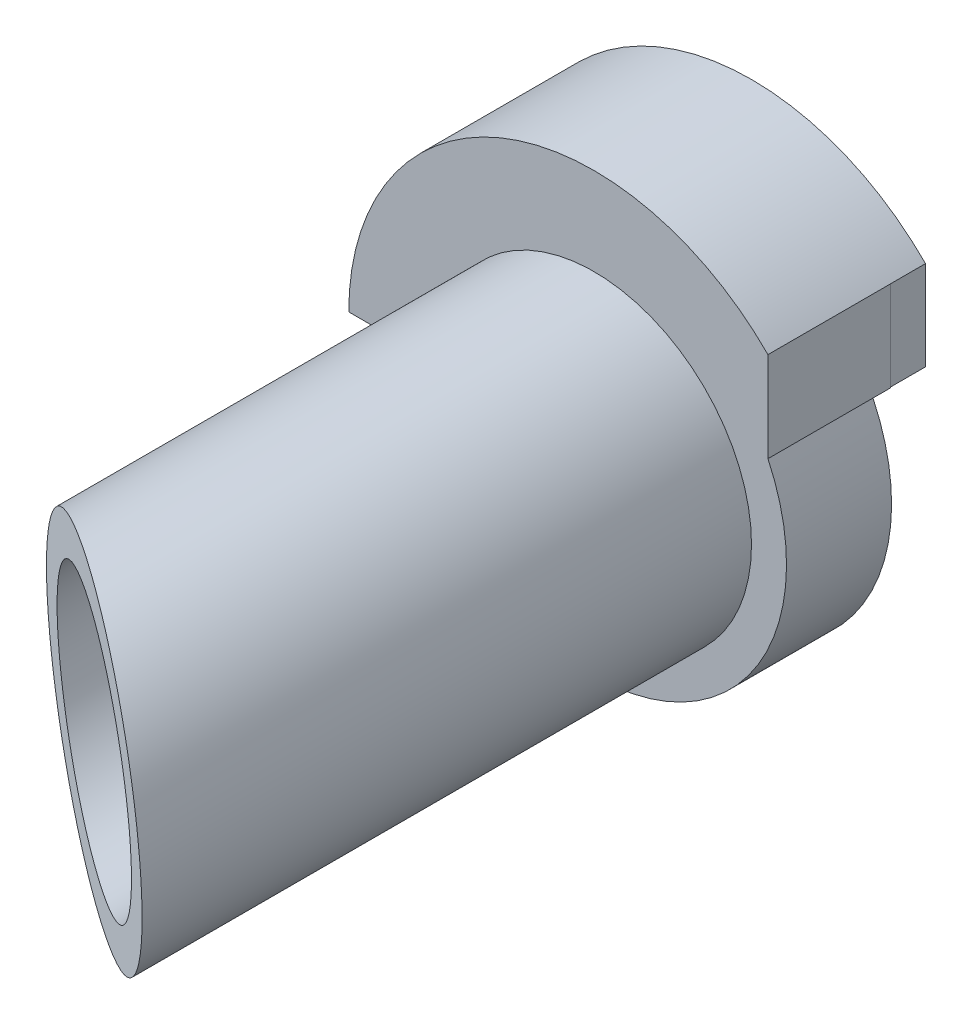
ISO-10303-21;
HEADER;
FILE_DESCRIPTION(('STEP AP214'),'2;1');
FILE_NAME('part.step','',(''),(''),'','','');
FILE_SCHEMA(('AUTOMOTIVE_DESIGN { 1 0 10303 214 1 1 1 1 }'));
ENDSEC;
DATA;
#1=APPLICATION_CONTEXT('core data for automotive mechanical design processes');
#2=APPLICATION_PROTOCOL_DEFINITION('international standard','automotive_design',2000,#1);
#3=PRODUCT_CONTEXT('',#1,'mechanical');
#4=PRODUCT('Part','Part','',(#3));
#5=PRODUCT_RELATED_PRODUCT_CATEGORY('part','',(#4));
#6=PRODUCT_DEFINITION_FORMATION('','',#4);
#7=PRODUCT_DEFINITION_CONTEXT('part definition',#1,'design');
#8=PRODUCT_DEFINITION('design','',#6,#7);
#9=PRODUCT_DEFINITION_SHAPE('','',#8);
#10=(LENGTH_UNIT() NAMED_UNIT(*) SI_UNIT(.MILLI.,.METRE.));
#11=(NAMED_UNIT(*) PLANE_ANGLE_UNIT() SI_UNIT($,.RADIAN.));
#12=(NAMED_UNIT(*) SI_UNIT($,.STERADIAN.) SOLID_ANGLE_UNIT());
#13=UNCERTAINTY_MEASURE_WITH_UNIT(LENGTH_MEASURE(1.E-05),#10,'distance_accuracy_value','');
#14=(GEOMETRIC_REPRESENTATION_CONTEXT(3) GLOBAL_UNCERTAINTY_ASSIGNED_CONTEXT((#13)) GLOBAL_UNIT_ASSIGNED_CONTEXT((#10,
#11,#12)) REPRESENTATION_CONTEXT('',''));
#15=CARTESIAN_POINT('',(0.,0.,0.));
#16=DIRECTION('',(0.,0.,1.));
#17=DIRECTION('',(1.,0.,0.));
#18=AXIS2_PLACEMENT_3D('',#15,#16,#17);
#19=CARTESIAN_POINT('',(34.7606486012994,-7.34844805721101,-3.));
#20=DIRECTION('',(0.,0.,1.));
#21=DIRECTION('',(1.,0.,0.));
#22=AXIS2_PLACEMENT_3D('',#19,#20,#21);
#23=PLANE('',#22);
#24=CARTESIAN_POINT('',(24.8641144943987,8.45138735436465E-09,-3.));
#25=DIRECTION('',(0.,0.,1.));
#26=DIRECTION('',(1.,0.,0.));
#27=AXIS2_PLACEMENT_3D('',#24,#25,#26);
#28=CIRCLE('',#27,11.);
#29=CARTESIAN_POINT('',(34.7899180614284,4.74114159553151,-3.));
#30=VERTEX_POINT('',#29);
#31=CARTESIAN_POINT('',(13.9815882219192,-1.6033159082641,-3.));
#32=VERTEX_POINT('',#31);
#33=EDGE_CURVE('E47',#30,#32,#28,.T.);
#34=ORIENTED_EDGE('',*,*,#33,.T.);
#35=CARTESIAN_POINT('',(12.1247494230307,-1.87688282889368,-3.));
#36=DIRECTION('',(0.,0.,1.));
#37=DIRECTION('',(1.,0.,0.));
#38=AXIS2_PLACEMENT_3D('',#35,#36,#37);
#39=CIRCLE('',#38,1.87688283734507);
#40=CARTESIAN_POINT('',(12.1247494230307,8.45138737638751E-09,-3.));
#41=VERTEX_POINT('',#40);
#42=EDGE_CURVE('E11',#32,#41,#39,.T.);
#43=ORIENTED_EDGE('',*,*,#42,.T.);
#44=DIRECTION('',(1.,0.,0.));
#45=VECTOR('',#44,1.);
#46=CARTESIAN_POINT('',(0.,8.45138735436465E-09,-3.));
#47=LINE('',#46,#45);
#48=CARTESIAN_POINT('',(10.8641144943987,8.45138735436465E-09,-3.));
#49=VERTEX_POINT('',#48);
#50=EDGE_CURVE('E167',#49,#41,#47,.T.);
#51=ORIENTED_EDGE('',*,*,#50,.F.);
#52=CARTESIAN_POINT('',(24.8641144943987,8.45138735436465E-09,-3.));
#53=DIRECTION('',(0.,0.,1.));
#54=DIRECTION('',(1.,0.,0.));
#55=AXIS2_PLACEMENT_3D('',#52,#53,#54);
#56=CIRCLE('',#55,14.);
#57=CARTESIAN_POINT('',(34.8023126053851,9.86063986125948,-3.));
#58=VERTEX_POINT('',#57);
#59=EDGE_CURVE('E164',#58,#49,#56,.T.);
#60=ORIENTED_EDGE('',*,*,#59,.F.);
#61=DIRECTION('',(0.00242103952152746,0.999997069279523,0.));
#62=VECTOR('',#61,1.);
#63=CARTESIAN_POINT('',(34.7897608189359,4.67619344814951,-3.));
#64=LINE('',#63,#62);
#65=EDGE_CURVE('E42',#30,#58,#64,.T.);
#66=ORIENTED_EDGE('',*,*,#65,.F.);
#67=EDGE_LOOP('',(#34,#43,#51,#60,#66));
#68=FACE_BOUND('',#67,.T.);
#69=ADVANCED_FACE('F39',(#68),#23,.F.);
#70=CARTESIAN_POINT('',(34.8037052749013,0.,0.));
#71=DIRECTION('',(1.,0.,0.));
#72=DIRECTION('',(0.,1.,0.));
#73=AXIS2_PLACEMENT_3D('',#70,#71,#72);
#74=PLANE('',#73);
#75=DIRECTION('',(0.,0.,-1.));
#76=VECTOR('',#75,1.);
#77=CARTESIAN_POINT('',(34.8037052749013,4.71216884202979,0.));
#78=LINE('',#77,#76);
#79=CARTESIAN_POINT('',(34.8037052749013,4.71216884202979,0.));
#80=VERTEX_POINT('',#79);
#81=CARTESIAN_POINT('',(34.8037052749013,4.71216884202979,-0.999999999999873));
#82=VERTEX_POINT('',#81);
#83=EDGE_CURVE('E171',#80,#82,#78,.T.);
#84=ORIENTED_EDGE('',*,*,#83,.T.);
#85=DIRECTION('',(0.,1.,0.));
#86=VECTOR('',#85,1.);
#87=CARTESIAN_POINT('',(34.8037052749013,0.,-0.999999999999873));
#88=LINE('',#87,#86);
#89=CARTESIAN_POINT('',(34.8037052749013,9.85923603951118,-0.999999999999873));
#90=VERTEX_POINT('',#89);
#91=EDGE_CURVE('E112',#82,#90,#88,.T.);
#92=ORIENTED_EDGE('',*,*,#91,.T.);
#93=DIRECTION('',(0.,0.,-1.));
#94=VECTOR('',#93,1.);
#95=CARTESIAN_POINT('',(34.8037052749013,9.85923603951118,0.));
#96=LINE('',#95,#94);
#97=CARTESIAN_POINT('',(34.8037052749013,9.85923603951118,6.));
#98=VERTEX_POINT('',#97);
#99=EDGE_CURVE('E123',#98,#90,#96,.T.);
#100=ORIENTED_EDGE('',*,*,#99,.F.);
#101=DIRECTION('',(0.,-1.,0.));
#102=VECTOR('',#101,1.);
#103=CARTESIAN_POINT('',(34.8037052749013,0.,6.));
#104=LINE('',#103,#102);
#105=CARTESIAN_POINT('',(34.8037052749013,4.71216884202979,6.));
#106=VERTEX_POINT('',#105);
#107=EDGE_CURVE('E159',#98,#106,#104,.T.);
#108=ORIENTED_EDGE('',*,*,#107,.T.);
#109=EDGE_CURVE('E172',#106,#80,#78,.T.);
#110=ORIENTED_EDGE('',*,*,#109,.T.);
#111=EDGE_LOOP('',(#84,#92,#100,#108,#110));
#112=FACE_BOUND('',#111,.T.);
#113=ADVANCED_FACE('F180',(#112),#74,.T.);
#114=CARTESIAN_POINT('',(34.7897608189359,4.67619344814951,-39.));
#115=DIRECTION('',(-0.999997069279523,0.00242103952152746,0.));
#116=DIRECTION('',(-0.00242103952152746,-0.999997069279523,0.));
#117=AXIS2_PLACEMENT_3D('',#114,#115,#116);
#118=PLANE('',#117);
#119=DIRECTION('',(0.,0.,-1.));
#120=VECTOR('',#119,1.);
#121=CARTESIAN_POINT('',(34.7899180614284,4.74114159553151,0.));
#122=LINE('',#121,#120);
#123=CARTESIAN_POINT('',(34.7899180614284,4.74114159553154,-0.999999999999873));
#124=VERTEX_POINT('',#123);
#125=EDGE_CURVE('E125',#124,#30,#122,.T.);
#126=ORIENTED_EDGE('',*,*,#125,.T.);
#127=ORIENTED_EDGE('',*,*,#65,.T.);
#128=DIRECTION('',(0.,0.,-1.));
#129=VECTOR('',#128,1.);
#130=CARTESIAN_POINT('',(34.8023126053851,9.86063986125948,0.));
#131=LINE('',#130,#129);
#132=CARTESIAN_POINT('',(34.802312605385,9.8606398612595,-0.999999999999873));
#133=VERTEX_POINT('',#132);
#134=EDGE_CURVE('E104',#133,#58,#131,.T.);
#135=ORIENTED_EDGE('',*,*,#134,.F.);
#136=DIRECTION('',(-0.00242103952152748,-0.999997069279524,0.));
#137=VECTOR('',#136,1.);
#138=CARTESIAN_POINT('',(34.778235685137,-0.0841997298487024,-0.999999999999873));
#139=LINE('',#138,#137);
#140=EDGE_CURVE('E108',#133,#124,#139,.T.);
#141=ORIENTED_EDGE('',*,*,#140,.T.);
#142=EDGE_LOOP('',(#126,#127,#135,#141));
#143=FACE_BOUND('',#142,.T.);
#144=ADVANCED_FACE('F107',(#143),#118,.F.);
#145=CARTESIAN_POINT('',(24.8641144943987,8.45138735436465E-09,0.));
#146=DIRECTION('',(0.,0.,-1.));
#147=DIRECTION('',(-1.,0.,0.));
#148=AXIS2_PLACEMENT_3D('',#145,#146,#147);
#149=CYLINDRICAL_SURFACE('',#148,11.);
#150=ORIENTED_EDGE('',*,*,#125,.F.);
#151=CARTESIAN_POINT('',(24.8641144943987,8.45138735436465E-09,-0.999999999999873));
#152=DIRECTION('',(0.,0.,-0.999999999999998));
#153=DIRECTION('',(0.,1.,0.));
#154=AXIS2_PLACEMENT_3D('',#151,#152,#153);
#155=CIRCLE('',#154,11.);
#156=EDGE_CURVE('E118',#124,#82,#155,.T.);
#157=ORIENTED_EDGE('',*,*,#156,.T.);
#158=ORIENTED_EDGE('',*,*,#83,.F.);
#159=CARTESIAN_POINT('',(24.8641144943987,8.45138735436465E-09,0.));
#160=DIRECTION('',(0.,0.,1.));
#161=DIRECTION('',(1.,0.,0.));
#162=AXIS2_PLACEMENT_3D('',#159,#160,#161);
#163=CIRCLE('',#162,11.);
#164=CARTESIAN_POINT('',(13.9815882219192,-1.6033159082641,0.));
#165=VERTEX_POINT('',#164);
#166=EDGE_CURVE('E146',#80,#165,#163,.T.);
#167=ORIENTED_EDGE('',*,*,#166,.T.);
#168=DIRECTION('',(0.,0.,1.));
#169=VECTOR('',#168,1.);
#170=CARTESIAN_POINT('',(13.9815882219192,-1.6033159082641,-3.));
#171=LINE('',#170,#169);
#172=EDGE_CURVE('E162',#32,#165,#171,.T.);
#173=ORIENTED_EDGE('',*,*,#172,.F.);
#174=ORIENTED_EDGE('',*,*,#33,.F.);
#175=EDGE_LOOP('',(#150,#157,#158,#167,#173,#174));
#176=FACE_BOUND('',#175,.T.);
#177=ADVANCED_FACE('F182',(#176),#149,.F.);
#178=CARTESIAN_POINT('',(24.8641144943987,8.45138735436465E-09,0.));
#179=DIRECTION('',(0.,0.,-1.));
#180=DIRECTION('',(-1.,0.,0.));
#181=AXIS2_PLACEMENT_3D('',#178,#179,#180);
#182=CYLINDRICAL_SURFACE('',#181,14.);
#183=CARTESIAN_POINT('',(24.8641144943987,8.45138735436465E-09,-0.999999999999873));
#184=DIRECTION('',(0.,0.,-0.999999999999998));
#185=DIRECTION('',(0.,1.,0.));
#186=AXIS2_PLACEMENT_3D('',#183,#184,#185);
#187=CIRCLE('',#186,14.);
#188=EDGE_CURVE('E115',#133,#90,#187,.T.);
#189=ORIENTED_EDGE('',*,*,#188,.F.);
#190=ORIENTED_EDGE('',*,*,#134,.T.);
#191=ORIENTED_EDGE('',*,*,#59,.T.);
#192=DIRECTION('',(0.,0.,-1.));
#193=VECTOR('',#192,1.);
#194=CARTESIAN_POINT('',(10.8641144943987,8.45138735436465E-09,0.));
#195=LINE('',#194,#193);
#196=CARTESIAN_POINT('',(10.8641144943987,8.45138735436465E-09,6.));
#197=VERTEX_POINT('',#196);
#198=EDGE_CURVE('E175',#197,#49,#195,.T.);
#199=ORIENTED_EDGE('',*,*,#198,.F.);
#200=CARTESIAN_POINT('',(24.8641144943987,8.45138735436465E-09,6.));
#201=DIRECTION('',(0.,0.,1.));
#202=DIRECTION('',(1.,0.,0.));
#203=AXIS2_PLACEMENT_3D('',#200,#201,#202);
#204=CIRCLE('',#203,14.);
#205=EDGE_CURVE('E150',#98,#197,#204,.T.);
#206=ORIENTED_EDGE('',*,*,#205,.F.);
#207=ORIENTED_EDGE('',*,*,#99,.T.);
#208=EDGE_LOOP('',(#189,#190,#191,#199,#206,#207));
#209=FACE_BOUND('',#208,.T.);
#210=ADVANCED_FACE('F121',(#209),#182,.T.);
#211=CARTESIAN_POINT('',(0.,8.45138735436465E-09,0.));
#212=DIRECTION('',(0.,1.,0.));
#213=DIRECTION('',(0.,0.,1.));
#214=AXIS2_PLACEMENT_3D('',#211,#212,#213);
#215=PLANE('',#214);
#216=ORIENTED_EDGE('',*,*,#50,.T.);
#217=DIRECTION('',(0.,0.,1.));
#218=VECTOR('',#217,1.);
#219=CARTESIAN_POINT('',(12.1247494230307,8.45138736537608E-09,-3.));
#220=LINE('',#219,#218);
#221=CARTESIAN_POINT('',(12.1247494230307,8.45138736537608E-09,6.));
#222=VERTEX_POINT('',#221);
#223=EDGE_CURVE('E160',#41,#222,#220,.T.);
#224=ORIENTED_EDGE('',*,*,#223,.T.);
#225=DIRECTION('',(1.,0.,0.));
#226=VECTOR('',#225,1.);
#227=CARTESIAN_POINT('',(0.,8.45138735436465E-09,6.));
#228=LINE('',#227,#226);
#229=EDGE_CURVE('E153',#197,#222,#228,.T.);
#230=ORIENTED_EDGE('',*,*,#229,.F.);
#231=ORIENTED_EDGE('',*,*,#198,.T.);
#232=EDGE_LOOP('',(#216,#224,#230,#231));
#233=FACE_BOUND('',#232,.T.);
#234=ADVANCED_FACE('F189',(#233),#215,.F.);
#235=CARTESIAN_POINT('',(12.1247494230307,-1.87688282889368,-3.));
#236=DIRECTION('',(0.,0.,1.));
#237=DIRECTION('',(1.,0.,0.));
#238=AXIS2_PLACEMENT_3D('',#235,#236,#237);
#239=CYLINDRICAL_SURFACE('',#238,1.87688283734507);
#240=ORIENTED_EDGE('',*,*,#172,.T.);
#241=DIRECTION('',(0.,0.,-1.));
#242=VECTOR('',#241,1.);
#243=CARTESIAN_POINT('',(13.9815882219192,-1.6033159082641,3.));
#244=LINE('',#243,#242);
#245=CARTESIAN_POINT('',(13.9815882219192,-1.6033159082641,6.));
#246=VERTEX_POINT('',#245);
#247=EDGE_CURVE('E145',#246,#165,#244,.T.);
#248=ORIENTED_EDGE('',*,*,#247,.F.);
#249=CARTESIAN_POINT('',(12.1247494230307,-1.87688282889368,6.));
#250=DIRECTION('',(0.,0.,1.));
#251=DIRECTION('',(1.,0.,0.));
#252=AXIS2_PLACEMENT_3D('',#249,#250,#251);
#253=CIRCLE('',#252,1.87688283734507);
#254=EDGE_CURVE('E156',#246,#222,#253,.T.);
#255=ORIENTED_EDGE('',*,*,#254,.T.);
#256=ORIENTED_EDGE('',*,*,#223,.F.);
#257=ORIENTED_EDGE('',*,*,#42,.F.);
#258=EDGE_LOOP('',(#240,#248,#255,#256,#257));
#259=FACE_BOUND('',#258,.T.);
#260=ADVANCED_FACE('F185',(#259),#239,.F.);
#261=CARTESIAN_POINT('',(0.,0.,6.));
#262=DIRECTION('',(0.,0.,1.));
#263=DIRECTION('',(1.,0.,0.));
#264=AXIS2_PLACEMENT_3D('',#261,#262,#263);
#265=PLANE('',#264);
#266=ORIENTED_EDGE('',*,*,#205,.T.);
#267=ORIENTED_EDGE('',*,*,#229,.T.);
#268=ORIENTED_EDGE('',*,*,#254,.F.);
#269=CARTESIAN_POINT('',(24.8641144943987,8.45138735436465E-09,6.));
#270=DIRECTION('',(0.,0.,1.));
#271=DIRECTION('',(1.,0.,0.));
#272=AXIS2_PLACEMENT_3D('',#269,#270,#271);
#273=CIRCLE('',#272,11.);
#274=EDGE_CURVE('E142',#246,#106,#273,.T.);
#275=ORIENTED_EDGE('',*,*,#274,.T.);
#276=ORIENTED_EDGE('',*,*,#107,.F.);
#277=EDGE_LOOP('',(#266,#267,#268,#275,#276));
#278=FACE_BOUND('',#277,.T.);
#279=CARTESIAN_POINT('',(24.8641144943987,8.45138735436465E-09,6.));
#280=DIRECTION('',(0.,0.,1.));
#281=DIRECTION('',(1.,0.,0.));
#282=AXIS2_PLACEMENT_3D('',#279,#280,#281);
#283=CIRCLE('',#282,9.);
#284=CARTESIAN_POINT('',(33.8641144943987,8.45138735436465E-09,6.));
#285=VERTEX_POINT('',#284);
#286=EDGE_CURVE('E133',#285,#285,#283,.T.);
#287=ORIENTED_EDGE('',*,*,#286,.F.);
#288=EDGE_LOOP('',(#287));
#289=FACE_BOUND('',#288,.T.);
#290=ADVANCED_FACE('F191',(#278,#289),#265,.T.);
#291=CARTESIAN_POINT('',(24.8641144943987,8.45138735436465E-09,0.));
#292=DIRECTION('',(0.,0.,1.));
#293=DIRECTION('',(1.,0.,0.));
#294=AXIS2_PLACEMENT_3D('',#291,#292,#293);
#295=PLANE('',#294);
#296=ORIENTED_EDGE('',*,*,#166,.F.);
#297=EDGE_CURVE('E141',#165,#80,#163,.T.);
#298=ORIENTED_EDGE('',*,*,#297,.F.);
#299=EDGE_LOOP('',(#296,#298));
#300=FACE_BOUND('',#299,.T.);
#301=CARTESIAN_POINT('',(24.8641144943987,8.45138735436465E-09,0.));
#302=DIRECTION('',(0.,0.,1.));
#303=DIRECTION('',(1.,0.,0.));
#304=AXIS2_PLACEMENT_3D('',#301,#302,#303);
#305=CIRCLE('',#304,7.);
#306=CARTESIAN_POINT('',(31.8641144943987,8.45138735436465E-09,0.));
#307=VERTEX_POINT('',#306);
#308=EDGE_CURVE('E134',#307,#307,#305,.T.);
#309=ORIENTED_EDGE('',*,*,#308,.T.);
#310=EDGE_LOOP('',(#309));
#311=FACE_BOUND('',#310,.T.);
#312=ADVANCED_FACE('F202',(#300,#311),#295,.F.);
#313=CARTESIAN_POINT('',(24.8641144943987,8.45138735436465E-09,6.));
#314=DIRECTION('',(0.,0.,-1.));
#315=DIRECTION('',(-1.,0.,0.));
#316=AXIS2_PLACEMENT_3D('',#313,#314,#315);
#317=CYLINDRICAL_SURFACE('',#316,11.);
#318=ORIENTED_EDGE('',*,*,#109,.F.);
#319=ORIENTED_EDGE('',*,*,#274,.F.);
#320=ORIENTED_EDGE('',*,*,#247,.T.);
#321=ORIENTED_EDGE('',*,*,#297,.T.);
#322=EDGE_LOOP('',(#318,#319,#320,#321));
#323=FACE_BOUND('',#322,.T.);
#324=ADVANCED_FACE('F198',(#323),#317,.T.);
#325=CARTESIAN_POINT('',(24.8641144943987,8.45138735436465E-09,62.7991803989116));
#326=DIRECTION('',(0.,0.,-1.));
#327=DIRECTION('',(-1.,0.,0.));
#328=AXIS2_PLACEMENT_3D('',#325,#326,#327);
#329=CYLINDRICAL_SURFACE('',#328,9.);
#330=ORIENTED_EDGE('',*,*,#286,.T.);
#331=EDGE_LOOP('',(#330));
#332=FACE_BOUND('',#331,.T.);
#333=CARTESIAN_POINT('',(24.8641144943987,8.45138735436465E-09,34.5326345257715));
#334=DIRECTION('',(-0.572733704213555,-0.0320388360328345,0.819115142726272));
#335=DIRECTION('',(-0.817836512063118,-0.045749935299574,-0.573629133636463));
#336=AXIS2_PLACEMENT_3D('',#333,#334,#335);
#337=ELLIPSE('',#336,10.987466267618,9.);
#338=CARTESIAN_POINT('',(15.8781634056789,-0.502675862398387,28.229903769818));
#339=VERTEX_POINT('',#338);
#340=EDGE_CURVE('E130',#339,#339,#337,.T.);
#341=ORIENTED_EDGE('',*,*,#340,.F.);
#342=EDGE_LOOP('',(#341));
#343=FACE_BOUND('',#342,.T.);
#344=ADVANCED_FACE('F212',(#332,#343),#329,.T.);
#345=CARTESIAN_POINT('',(24.8641144943987,8.45138735436465E-09,62.7991803989116));
#346=DIRECTION('',(0.,0.,-1.));
#347=DIRECTION('',(-1.,0.,0.));
#348=AXIS2_PLACEMENT_3D('',#345,#346,#347);
#349=CYLINDRICAL_SURFACE('',#348,7.);
#350=ORIENTED_EDGE('',*,*,#308,.F.);
#351=EDGE_LOOP('',(#350));
#352=FACE_BOUND('',#351,.T.);
#353=CARTESIAN_POINT('',(24.8641144943987,8.45138735436465E-09,34.5326345257715));
#354=DIRECTION('',(-0.572733704213555,-0.0320388360328345,0.819115142726272));
#355=DIRECTION('',(-0.817836512063118,-0.045749935299574,-0.573629133636463));
#356=AXIS2_PLACEMENT_3D('',#353,#354,#355);
#357=ELLIPSE('',#356,8.54580709703621,7.);
#358=CARTESIAN_POINT('',(17.8750414253944,-0.39097011332066,29.6305106044743));
#359=VERTEX_POINT('',#358);
#360=EDGE_CURVE('E129',#359,#359,#357,.T.);
#361=ORIENTED_EDGE('',*,*,#360,.T.);
#362=EDGE_LOOP('',(#361));
#363=FACE_BOUND('',#362,.T.);
#364=ADVANCED_FACE('F208',(#352,#363),#349,.F.);
#365=CARTESIAN_POINT('',(-31.4697442557162,105.777313341923,-0.719207480964601));
#366=DIRECTION('',(-0.572733704213555,-0.0320388360328345,0.819115142726272));
#367=DIRECTION('',(-0.817836512063118,-0.0457499352995732,-0.573629133636463));
#368=AXIS2_PLACEMENT_3D('',#365,#366,#367);
#369=PLANE('',#368);
#370=ORIENTED_EDGE('',*,*,#360,.F.);
#371=EDGE_LOOP('',(#370));
#372=FACE_BOUND('',#371,.T.);
#373=ORIENTED_EDGE('',*,*,#340,.T.);
#374=EDGE_LOOP('',(#373));
#375=FACE_BOUND('',#374,.T.);
#376=ADVANCED_FACE('F211',(#372,#375),#369,.T.);
#377=CARTESIAN_POINT('',(0.,0.,-0.999999999999873));
#378=DIRECTION('',(0.,0.,-0.999999999999998));
#379=DIRECTION('',(-1.,0.,0.));
#380=AXIS2_PLACEMENT_3D('',#377,#378,#379);
#381=PLANE('',#380);
#382=ORIENTED_EDGE('',*,*,#140,.F.);
#383=ORIENTED_EDGE('',*,*,#188,.T.);
#384=ORIENTED_EDGE('',*,*,#91,.F.);
#385=ORIENTED_EDGE('',*,*,#156,.F.);
#386=EDGE_LOOP('',(#382,#383,#384,#385));
#387=FACE_BOUND('',#386,.T.);
#388=ADVANCED_FACE('F114',(#387),#381,.T.);
#389=CLOSED_SHELL('',(#69,#113,#144,#177,#210,#234,#260,#290,#312,#324,#344,#364,#376,#388));
#390=MANIFOLD_SOLID_BREP('B2',#389);
#391=ADVANCED_BREP_SHAPE_REPRESENTATION('',(#18,#390),#14);
#392=SHAPE_DEFINITION_REPRESENTATION(#9,#391);
ENDSEC;
END-ISO-10303-21;
